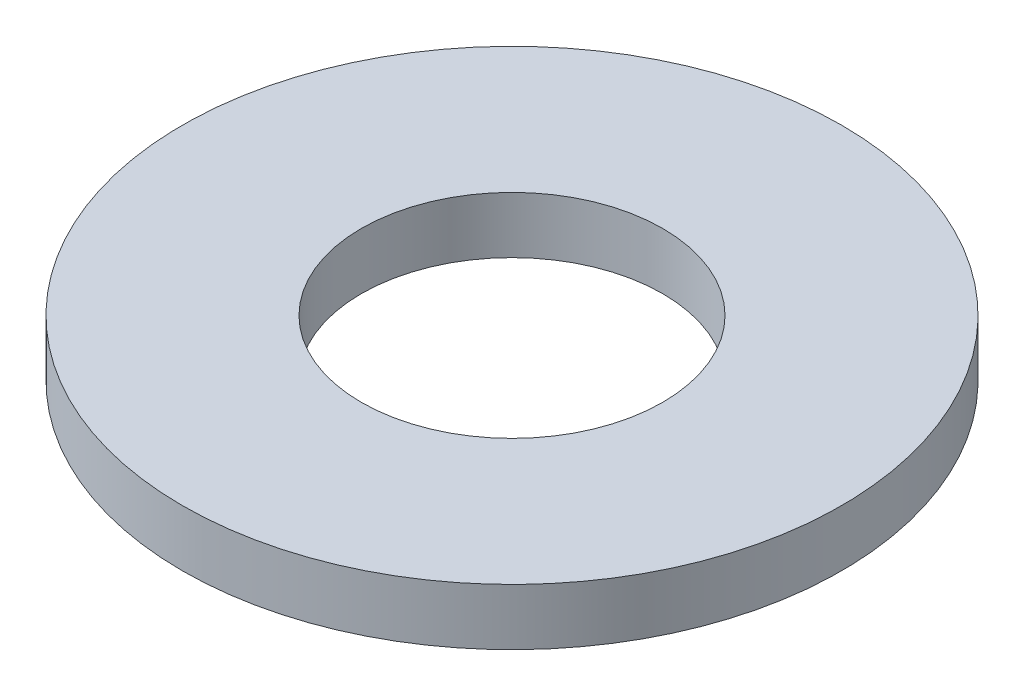
ISO-10303-21;
HEADER;
FILE_DESCRIPTION(('STEP AP214'),'2;1');
FILE_NAME('part.step','',(''),(''),'','','');
FILE_SCHEMA(('AUTOMOTIVE_DESIGN { 1 0 10303 214 1 1 1 1 }'));
ENDSEC;
DATA;
#1=APPLICATION_CONTEXT('core data for automotive mechanical design processes');
#2=APPLICATION_PROTOCOL_DEFINITION('international standard','automotive_design',2000,#1);
#3=PRODUCT_CONTEXT('',#1,'mechanical');
#4=PRODUCT('Part','Part','',(#3));
#5=PRODUCT_RELATED_PRODUCT_CATEGORY('part','',(#4));
#6=PRODUCT_DEFINITION_FORMATION('','',#4);
#7=PRODUCT_DEFINITION_CONTEXT('part definition',#1,'design');
#8=PRODUCT_DEFINITION('design','',#6,#7);
#9=PRODUCT_DEFINITION_SHAPE('','',#8);
#10=(LENGTH_UNIT() NAMED_UNIT(*) SI_UNIT(.MILLI.,.METRE.));
#11=(NAMED_UNIT(*) PLANE_ANGLE_UNIT() SI_UNIT($,.RADIAN.));
#12=(NAMED_UNIT(*) SI_UNIT($,.STERADIAN.) SOLID_ANGLE_UNIT());
#13=UNCERTAINTY_MEASURE_WITH_UNIT(LENGTH_MEASURE(1.E-05),#10,'distance_accuracy_value','');
#14=(GEOMETRIC_REPRESENTATION_CONTEXT(3) GLOBAL_UNCERTAINTY_ASSIGNED_CONTEXT((#13)) GLOBAL_UNIT_ASSIGNED_CONTEXT((#10,
#11,#12)) REPRESENTATION_CONTEXT('',''));
#15=CARTESIAN_POINT('',(0.,0.,0.));
#16=DIRECTION('',(0.,0.,1.));
#17=DIRECTION('',(1.,0.,0.));
#18=AXIS2_PLACEMENT_3D('',#15,#16,#17);
#19=CARTESIAN_POINT('',(0.,1.2,0.));
#20=DIRECTION('',(0.,-1.,0.));
#21=DIRECTION('',(0.,0.,-1.));
#22=AXIS2_PLACEMENT_3D('',#19,#20,#21);
#23=CYLINDRICAL_SURFACE('',#22,7.);
#24=CARTESIAN_POINT('',(0.,1.2,0.));
#25=DIRECTION('',(0.,1.,0.));
#26=DIRECTION('',(0.,0.,1.));
#27=AXIS2_PLACEMENT_3D('',#24,#25,#26);
#28=CIRCLE('',#27,7.);
#29=CARTESIAN_POINT('',(0.,1.2,7.));
#30=VERTEX_POINT('',#29);
#31=EDGE_CURVE('E10',#30,#30,#28,.T.);
#32=ORIENTED_EDGE('',*,*,#31,.F.);
#33=EDGE_LOOP('',(#32));
#34=FACE_BOUND('',#33,.T.);
#35=CARTESIAN_POINT('',(0.,0.,0.));
#36=DIRECTION('',(0.,1.,0.));
#37=DIRECTION('',(0.,0.,1.));
#38=AXIS2_PLACEMENT_3D('',#35,#36,#37);
#39=CIRCLE('',#38,7.);
#40=CARTESIAN_POINT('',(0.,0.,7.));
#41=VERTEX_POINT('',#40);
#42=EDGE_CURVE('E34',#41,#41,#39,.T.);
#43=ORIENTED_EDGE('',*,*,#42,.T.);
#44=EDGE_LOOP('',(#43));
#45=FACE_BOUND('',#44,.T.);
#46=ADVANCED_FACE('F31',(#34,#45),#23,.T.);
#47=CARTESIAN_POINT('',(0.,1.2,0.));
#48=DIRECTION('',(0.,1.,0.));
#49=DIRECTION('',(0.,0.,1.));
#50=AXIS2_PLACEMENT_3D('',#47,#48,#49);
#51=PLANE('',#50);
#52=CARTESIAN_POINT('',(0.,1.2,0.));
#53=DIRECTION('',(0.,1.,0.));
#54=DIRECTION('',(0.,0.,1.));
#55=AXIS2_PLACEMENT_3D('',#52,#53,#54);
#56=CIRCLE('',#55,3.2);
#57=CARTESIAN_POINT('',(0.,1.2,3.2));
#58=VERTEX_POINT('',#57);
#59=EDGE_CURVE('E43',#58,#58,#56,.T.);
#60=ORIENTED_EDGE('',*,*,#59,.F.);
#61=EDGE_LOOP('',(#60));
#62=FACE_BOUND('',#61,.T.);
#63=ORIENTED_EDGE('',*,*,#31,.T.);
#64=EDGE_LOOP('',(#63));
#65=FACE_BOUND('',#64,.T.);
#66=ADVANCED_FACE('F58',(#62,#65),#51,.T.);
#67=CARTESIAN_POINT('',(0.,0.,0.));
#68=DIRECTION('',(0.,1.,0.));
#69=DIRECTION('',(0.,0.,1.));
#70=AXIS2_PLACEMENT_3D('',#67,#68,#69);
#71=PLANE('',#70);
#72=CARTESIAN_POINT('',(0.,0.,0.));
#73=DIRECTION('',(0.,1.,0.));
#74=DIRECTION('',(0.,0.,1.));
#75=AXIS2_PLACEMENT_3D('',#72,#73,#74);
#76=CIRCLE('',#75,3.2);
#77=CARTESIAN_POINT('',(0.,0.,3.2));
#78=VERTEX_POINT('',#77);
#79=EDGE_CURVE('E41',#78,#78,#76,.T.);
#80=ORIENTED_EDGE('',*,*,#79,.T.);
#81=EDGE_LOOP('',(#80));
#82=FACE_BOUND('',#81,.T.);
#83=ORIENTED_EDGE('',*,*,#42,.F.);
#84=EDGE_LOOP('',(#83));
#85=FACE_BOUND('',#84,.T.);
#86=ADVANCED_FACE('F49',(#82,#85),#71,.F.);
#87=CARTESIAN_POINT('',(0.,0.,0.));
#88=DIRECTION('',(0.,1.,0.));
#89=DIRECTION('',(0.,0.,1.));
#90=AXIS2_PLACEMENT_3D('',#87,#88,#89);
#91=CYLINDRICAL_SURFACE('',#90,3.2);
#92=ORIENTED_EDGE('',*,*,#79,.F.);
#93=EDGE_LOOP('',(#92));
#94=FACE_BOUND('',#93,.T.);
#95=ORIENTED_EDGE('',*,*,#59,.T.);
#96=EDGE_LOOP('',(#95));
#97=FACE_BOUND('',#96,.T.);
#98=ADVANCED_FACE('F52',(#94,#97),#91,.F.);
#99=CLOSED_SHELL('',(#46,#66,#86,#98));
#100=MANIFOLD_SOLID_BREP('B2',#99);
#101=ADVANCED_BREP_SHAPE_REPRESENTATION('',(#18,#100),#14);
#102=SHAPE_DEFINITION_REPRESENTATION(#9,#101);
ENDSEC;
END-ISO-10303-21;
